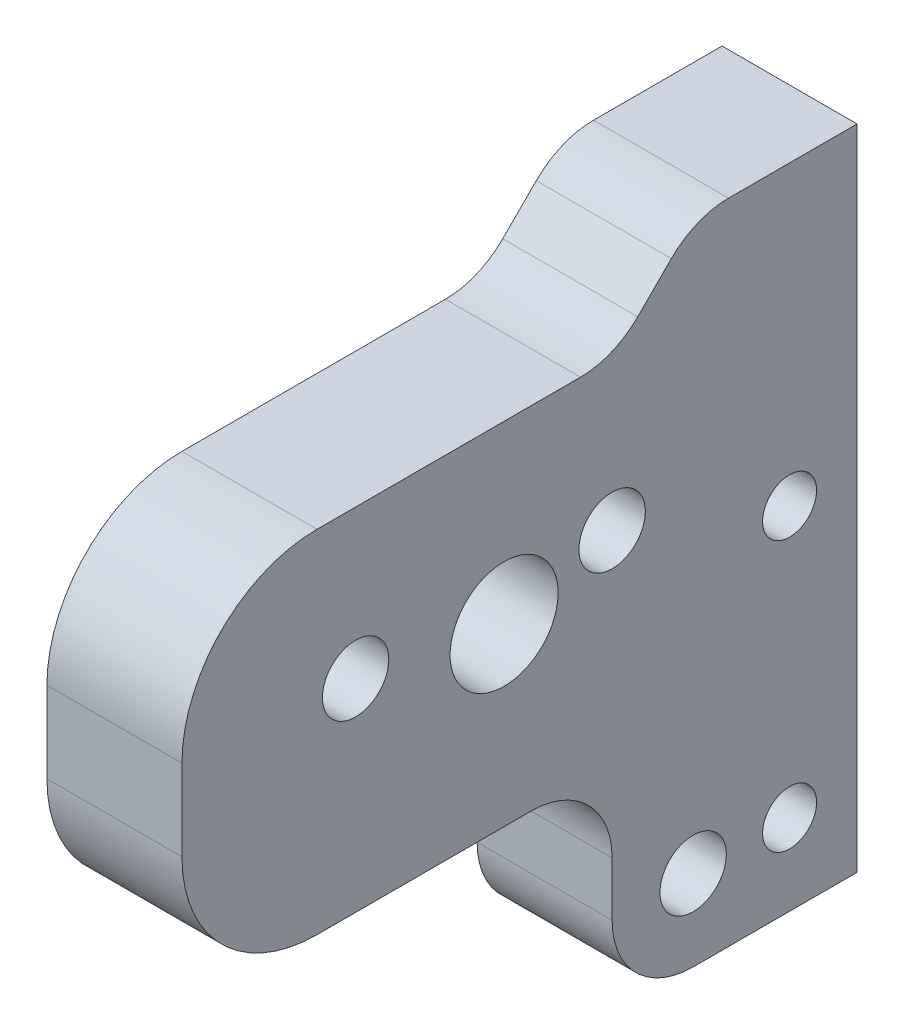
ISO-10303-21;
HEADER;
FILE_DESCRIPTION(('STEP AP214'),'2;1');
FILE_NAME('part.step','',(''),(''),'','','');
FILE_SCHEMA(('AUTOMOTIVE_DESIGN { 1 0 10303 214 1 1 1 1 }'));
ENDSEC;
DATA;
#1=APPLICATION_CONTEXT('core data for automotive mechanical design processes');
#2=APPLICATION_PROTOCOL_DEFINITION('international standard','automotive_design',2000,#1);
#3=PRODUCT_CONTEXT('',#1,'mechanical');
#4=PRODUCT('Part','Part','',(#3));
#5=PRODUCT_RELATED_PRODUCT_CATEGORY('part','',(#4));
#6=PRODUCT_DEFINITION_FORMATION('','',#4);
#7=PRODUCT_DEFINITION_CONTEXT('part definition',#1,'design');
#8=PRODUCT_DEFINITION('design','',#6,#7);
#9=PRODUCT_DEFINITION_SHAPE('','',#8);
#10=(LENGTH_UNIT() NAMED_UNIT(*) SI_UNIT(.MILLI.,.METRE.));
#11=(NAMED_UNIT(*) PLANE_ANGLE_UNIT() SI_UNIT($,.RADIAN.));
#12=(NAMED_UNIT(*) SI_UNIT($,.STERADIAN.) SOLID_ANGLE_UNIT());
#13=UNCERTAINTY_MEASURE_WITH_UNIT(LENGTH_MEASURE(1.E-05),#10,'distance_accuracy_value','');
#14=(GEOMETRIC_REPRESENTATION_CONTEXT(3) GLOBAL_UNCERTAINTY_ASSIGNED_CONTEXT((#13)) GLOBAL_UNIT_ASSIGNED_CONTEXT((#10,
#11,#12)) REPRESENTATION_CONTEXT('',''));
#15=CARTESIAN_POINT('',(0.,0.,0.));
#16=DIRECTION('',(0.,0.,1.));
#17=DIRECTION('',(1.,0.,0.));
#18=AXIS2_PLACEMENT_3D('',#15,#16,#17);
#19=CARTESIAN_POINT('',(5.,-8.729138766001,-7.36228469191367));
#20=DIRECTION('',(1.,0.,0.));
#21=DIRECTION('',(0.,0.,-1.));
#22=AXIS2_PLACEMENT_3D('',#19,#20,#21);
#23=PLANE('',#22);
#24=CARTESIAN_POINT('',(5.,-8.729138766001,-10.9322846915003));
#25=DIRECTION('',(1.,0.,0.));
#26=DIRECTION('',(0.,0.,-1.));
#27=AXIS2_PLACEMENT_3D('',#24,#25,#26);
#28=CIRCLE('',#27,1.);
#29=CARTESIAN_POINT('',(5.,-8.729138766001,-11.9322846915003));
#30=VERTEX_POINT('',#29);
#31=EDGE_CURVE('E287',#30,#30,#28,.T.);
#32=ORIENTED_EDGE('',*,*,#31,.F.);
#33=EDGE_LOOP('',(#32));
#34=FACE_BOUND('',#33,.T.);
#35=CARTESIAN_POINT('',(5.,3.77086123413889,-4.36228469150025));
#36=DIRECTION('',(1.,0.,0.));
#37=DIRECTION('',(0.,0.,-1.));
#38=AXIS2_PLACEMENT_3D('',#35,#36,#37);
#39=CIRCLE('',#38,1.2295);
#40=CARTESIAN_POINT('',(5.,3.77086123413889,-5.59178469150025));
#41=VERTEX_POINT('',#40);
#42=EDGE_CURVE('E279',#41,#41,#39,.T.);
#43=ORIENTED_EDGE('',*,*,#42,.F.);
#44=EDGE_LOOP('',(#43));
#45=FACE_BOUND('',#44,.T.);
#46=CARTESIAN_POINT('',(5.,3.77086123413892,5.13771530849975));
#47=DIRECTION('',(1.,0.,0.));
#48=DIRECTION('',(0.,0.,-1.));
#49=AXIS2_PLACEMENT_3D('',#46,#47,#48);
#50=CIRCLE('',#49,1.2295);
#51=CARTESIAN_POINT('',(5.,3.77086123413892,3.90821530849975));
#52=VERTEX_POINT('',#51);
#53=EDGE_CURVE('E253',#52,#52,#50,.T.);
#54=ORIENTED_EDGE('',*,*,#53,.F.);
#55=EDGE_LOOP('',(#54));
#56=FACE_BOUND('',#55,.T.);
#57=DIRECTION('',(0.,0.,1.));
#58=VECTOR('',#57,1.);
#59=CARTESIAN_POINT('',(5.,9.270861233999,8.56771530849975));
#60=LINE('',#59,#58);
#61=CARTESIAN_POINT('',(5.,9.270861233999,-3.18964400438096));
#62=VERTEX_POINT('',#61);
#63=CARTESIAN_POINT('',(5.,9.270861233999,6.56771530849975));
#64=VERTEX_POINT('',#63);
#65=EDGE_CURVE('E183',#62,#64,#60,.T.);
#66=ORIENTED_EDGE('',*,*,#65,.T.);
#67=CARTESIAN_POINT('',(5.,4.270861233999,6.56771530849975));
#68=DIRECTION('',(1.,0.,0.));
#69=DIRECTION('',(0.,0.,-1.));
#70=AXIS2_PLACEMENT_3D('',#67,#68,#69);
#71=CIRCLE('',#70,5.);
#72=CARTESIAN_POINT('',(5.,4.27086123399899,11.5677153084997));
#73=VERTEX_POINT('',#72);
#74=EDGE_CURVE('E46',#64,#73,#71,.T.);
#75=ORIENTED_EDGE('',*,*,#74,.T.);
#76=DIRECTION('',(0.,-1.,0.));
#77=VECTOR('',#76,1.);
#78=CARTESIAN_POINT('',(5.,-3.729138766001,11.5677153084997));
#79=LINE('',#78,#77);
#80=CARTESIAN_POINT('',(5.,1.27086123399899,11.5677153084997));
#81=VERTEX_POINT('',#80);
#82=EDGE_CURVE('E182',#73,#81,#79,.T.);
#83=ORIENTED_EDGE('',*,*,#82,.T.);
#84=CARTESIAN_POINT('',(5.,1.270861233999,6.56771530849974));
#85=DIRECTION('',(1.,0.,0.));
#86=DIRECTION('',(0.,0.,-1.));
#87=AXIS2_PLACEMENT_3D('',#84,#85,#86);
#88=CIRCLE('',#87,5.);
#89=CARTESIAN_POINT('',(5.,-3.729138766001,6.56771530849974));
#90=VERTEX_POINT('',#89);
#91=EDGE_CURVE('E52',#81,#90,#88,.T.);
#92=ORIENTED_EDGE('',*,*,#91,.T.);
#93=DIRECTION('',(0.,0.,-1.));
#94=VECTOR('',#93,1.);
#95=CARTESIAN_POINT('',(5.,-3.729138766001,-1.36228469191368));
#96=LINE('',#95,#94);
#97=CARTESIAN_POINT('',(5.,-3.729138766001,-1.36228469191368));
#98=VERTEX_POINT('',#97);
#99=EDGE_CURVE('E195',#90,#98,#96,.T.);
#100=ORIENTED_EDGE('',*,*,#99,.T.);
#101=CARTESIAN_POINT('',(5.,-6.729138766001,-1.36228469191368));
#102=DIRECTION('',(-1.,0.,0.));
#103=DIRECTION('',(0.,0.,-1.));
#104=AXIS2_PLACEMENT_3D('',#101,#102,#103);
#105=CIRCLE('',#104,3.);
#106=CARTESIAN_POINT('',(5.,-6.72913876600097,-4.36228469191368));
#107=VERTEX_POINT('',#106);
#108=EDGE_CURVE('E261',#98,#107,#105,.T.);
#109=ORIENTED_EDGE('',*,*,#108,.T.);
#110=DIRECTION('',(0.,-1.,0.));
#111=VECTOR('',#110,1.);
#112=CARTESIAN_POINT('',(5.,-8.729138766001,-4.36228469191368));
#113=LINE('',#112,#111);
#114=CARTESIAN_POINT('',(5.,-8.729138766001,-4.36228469191368));
#115=VERTEX_POINT('',#114);
#116=EDGE_CURVE('E256',#107,#115,#113,.T.);
#117=ORIENTED_EDGE('',*,*,#116,.T.);
#118=CARTESIAN_POINT('',(5.,-8.729138766001,-7.36228469191367));
#119=DIRECTION('',(1.,0.,0.));
#120=DIRECTION('',(0.,0.,-1.));
#121=AXIS2_PLACEMENT_3D('',#118,#119,#120);
#122=CIRCLE('',#121,3.);
#123=CARTESIAN_POINT('',(5.,-11.729138766001,-7.36228469191367));
#124=VERTEX_POINT('',#123);
#125=EDGE_CURVE('E260',#115,#124,#122,.T.);
#126=ORIENTED_EDGE('',*,*,#125,.T.);
#127=DIRECTION('',(0.,0.,-1.));
#128=VECTOR('',#127,1.);
#129=CARTESIAN_POINT('',(5.,-11.729138766001,-13.4322846915003));
#130=LINE('',#129,#128);
#131=CARTESIAN_POINT('',(5.,-11.729138766001,-13.4322846915003));
#132=VERTEX_POINT('',#131);
#133=EDGE_CURVE('E160',#124,#132,#130,.T.);
#134=ORIENTED_EDGE('',*,*,#133,.T.);
#135=DIRECTION('',(0.,1.,0.));
#136=VECTOR('',#135,1.);
#137=CARTESIAN_POINT('',(5.,12.270861233999,-13.4322846915003));
#138=LINE('',#137,#136);
#139=CARTESIAN_POINT('',(5.,12.270861233999,-13.4322846915003));
#140=VERTEX_POINT('',#139);
#141=EDGE_CURVE('E155',#132,#140,#138,.T.);
#142=ORIENTED_EDGE('',*,*,#141,.T.);
#143=DIRECTION('',(0.,0.,1.));
#144=VECTOR('',#143,1.);
#145=CARTESIAN_POINT('',(5.,12.270861233999,-8.67492537861952));
#146=LINE('',#145,#144);
#147=CARTESIAN_POINT('',(5.,12.270861233999,-8.67492537861952));
#148=VERTEX_POINT('',#147);
#149=EDGE_CURVE('E145',#140,#148,#146,.T.);
#150=ORIENTED_EDGE('',*,*,#149,.T.);
#151=CARTESIAN_POINT('',(5.,9.270861233999,-8.67492537861953));
#152=DIRECTION('',(1.,0.,0.));
#153=DIRECTION('',(0.,0.,-1.));
#154=AXIS2_PLACEMENT_3D('',#151,#152,#153);
#155=CIRCLE('',#154,3.00000000000001);
#156=CARTESIAN_POINT('',(5.,11.3921815775586,-6.55360503505988));
#157=VERTEX_POINT('',#156);
#158=EDGE_CURVE('E151',#148,#157,#155,.T.);
#159=ORIENTED_EDGE('',*,*,#158,.T.);
#160=DIRECTION('',(0.,-0.707106781186548,0.707106781186547));
#161=VECTOR('',#160,1.);
#162=CARTESIAN_POINT('',(5.,11.3921815775586,-6.55360503505988));
#163=LINE('',#162,#161);
#164=CARTESIAN_POINT('',(5.,10.1495408904394,-5.3109643479406));
#165=VERTEX_POINT('',#164);
#166=EDGE_CURVE('E246',#157,#165,#163,.T.);
#167=ORIENTED_EDGE('',*,*,#166,.T.);
#168=CARTESIAN_POINT('',(5.,12.270861233999,-3.18964400438097));
#169=DIRECTION('',(-1.,0.,0.));
#170=DIRECTION('',(0.,0.,-1.));
#171=AXIS2_PLACEMENT_3D('',#168,#169,#170);
#172=CIRCLE('',#171,2.99999999999999);
#173=EDGE_CURVE('E264',#165,#62,#172,.T.);
#174=ORIENTED_EDGE('',*,*,#173,.T.);
#175=EDGE_LOOP('',(#66,#75,#83,#92,#100,#109,#117,#126,#134,#142,#150,#159,#167,#174));
#176=FACE_BOUND('',#175,.T.);
#177=CARTESIAN_POINT('',(5.,2.770861233999,-0.36228469150025));
#178=DIRECTION('',(1.,0.,0.));
#179=DIRECTION('',(0.,0.,-1.));
#180=AXIS2_PLACEMENT_3D('',#177,#178,#179);
#181=CIRCLE('',#180,2.);
#182=CARTESIAN_POINT('',(5.,2.770861233999,-2.36228469150025));
#183=VERTEX_POINT('',#182);
#184=EDGE_CURVE('E275',#183,#183,#181,.T.);
#185=ORIENTED_EDGE('',*,*,#184,.F.);
#186=EDGE_LOOP('',(#185));
#187=FACE_BOUND('',#186,.T.);
#188=CARTESIAN_POINT('',(5.,-8.729138766001,-7.36228469191367));
#189=DIRECTION('',(1.,0.,0.));
#190=DIRECTION('',(0.,0.,-1.));
#191=AXIS2_PLACEMENT_3D('',#188,#189,#190);
#192=CIRCLE('',#191,1.2295);
#193=CARTESIAN_POINT('',(5.,-8.729138766001,-8.59178469191367));
#194=VERTEX_POINT('',#193);
#195=EDGE_CURVE('E283',#194,#194,#192,.T.);
#196=ORIENTED_EDGE('',*,*,#195,.F.);
#197=EDGE_LOOP('',(#196));
#198=FACE_BOUND('',#197,.T.);
#199=CARTESIAN_POINT('',(5.,1.270861233999,-10.9322846915003));
#200=DIRECTION('',(1.,0.,0.));
#201=DIRECTION('',(0.,0.,-1.));
#202=AXIS2_PLACEMENT_3D('',#199,#200,#201);
#203=CIRCLE('',#202,0.999999999999998);
#204=CARTESIAN_POINT('',(5.,1.270861233999,-11.9322846915002));
#205=VERTEX_POINT('',#204);
#206=EDGE_CURVE('E298',#205,#205,#203,.T.);
#207=ORIENTED_EDGE('',*,*,#206,.F.);
#208=EDGE_LOOP('',(#207));
#209=FACE_BOUND('',#208,.T.);
#210=ADVANCED_FACE('F36',(#34,#45,#56,#176,#187,#198,#209),#23,.T.);
#211=CARTESIAN_POINT('',(0.,-8.729138766001,-7.36228469191367));
#212=DIRECTION('',(1.,0.,0.));
#213=DIRECTION('',(0.,0.,-1.));
#214=AXIS2_PLACEMENT_3D('',#211,#212,#213);
#215=PLANE('',#214);
#216=DIRECTION('',(0.,-1.,0.));
#217=VECTOR('',#216,1.);
#218=CARTESIAN_POINT('',(0.,-3.729138766001,11.5677153084997));
#219=LINE('',#218,#217);
#220=CARTESIAN_POINT('',(0.,4.27086123399899,11.5677153084997));
#221=VERTEX_POINT('',#220);
#222=CARTESIAN_POINT('',(0.,1.27086123399899,11.5677153084997));
#223=VERTEX_POINT('',#222);
#224=EDGE_CURVE('E202',#221,#223,#219,.T.);
#225=ORIENTED_EDGE('',*,*,#224,.F.);
#226=CARTESIAN_POINT('',(0.,4.270861233999,6.56771530849975));
#227=DIRECTION('',(1.,0.,0.));
#228=DIRECTION('',(0.,0.,-1.));
#229=AXIS2_PLACEMENT_3D('',#226,#227,#228);
#230=CIRCLE('',#229,5.);
#231=CARTESIAN_POINT('',(0.,9.270861233999,6.56771530849975));
#232=VERTEX_POINT('',#231);
#233=EDGE_CURVE('E178',#221,#232,#230,.F.);
#234=ORIENTED_EDGE('',*,*,#233,.T.);
#235=DIRECTION('',(0.,0.,1.));
#236=VECTOR('',#235,1.);
#237=CARTESIAN_POINT('',(0.,9.270861233999,11.5677153084998));
#238=LINE('',#237,#236);
#239=CARTESIAN_POINT('',(0.,9.270861233999,-3.18964400438096));
#240=VERTEX_POINT('',#239);
#241=EDGE_CURVE('E198',#240,#232,#238,.T.);
#242=ORIENTED_EDGE('',*,*,#241,.F.);
#243=CARTESIAN_POINT('',(0.,12.270861233999,-3.18964400438097));
#244=DIRECTION('',(-1.,0.,0.));
#245=DIRECTION('',(0.,0.,-1.));
#246=AXIS2_PLACEMENT_3D('',#243,#244,#245);
#247=CIRCLE('',#246,2.99999999999999);
#248=CARTESIAN_POINT('',(0.,10.1495408904394,-5.3109643479406));
#249=VERTEX_POINT('',#248);
#250=EDGE_CURVE('E207',#249,#240,#247,.T.);
#251=ORIENTED_EDGE('',*,*,#250,.F.);
#252=DIRECTION('',(0.,-0.707106781186548,0.707106781186547));
#253=VECTOR('',#252,1.);
#254=CARTESIAN_POINT('',(0.,11.3921815775586,-6.55360503505988));
#255=LINE('',#254,#253);
#256=CARTESIAN_POINT('',(0.,11.3921815775586,-6.55360503505988));
#257=VERTEX_POINT('',#256);
#258=EDGE_CURVE('E208',#257,#249,#255,.T.);
#259=ORIENTED_EDGE('',*,*,#258,.F.);
#260=CARTESIAN_POINT('',(0.,9.270861233999,-8.67492537861953));
#261=DIRECTION('',(1.,0.,0.));
#262=DIRECTION('',(0.,0.,-1.));
#263=AXIS2_PLACEMENT_3D('',#260,#261,#262);
#264=CIRCLE('',#263,3.00000000000001);
#265=CARTESIAN_POINT('',(0.,12.270861233999,-8.67492537861952));
#266=VERTEX_POINT('',#265);
#267=EDGE_CURVE('E248',#266,#257,#264,.T.);
#268=ORIENTED_EDGE('',*,*,#267,.F.);
#269=DIRECTION('',(0.,0.,1.));
#270=VECTOR('',#269,1.);
#271=CARTESIAN_POINT('',(0.,12.270861233999,-8.67492537861952));
#272=LINE('',#271,#270);
#273=CARTESIAN_POINT('',(0.,12.270861233999,-13.4322846915003));
#274=VERTEX_POINT('',#273);
#275=EDGE_CURVE('E249',#274,#266,#272,.T.);
#276=ORIENTED_EDGE('',*,*,#275,.F.);
#277=DIRECTION('',(0.,1.,0.));
#278=VECTOR('',#277,1.);
#279=CARTESIAN_POINT('',(0.,12.270861233999,-13.4322846915003));
#280=LINE('',#279,#278);
#281=CARTESIAN_POINT('',(0.,-11.729138766001,-13.4322846915003));
#282=VERTEX_POINT('',#281);
#283=EDGE_CURVE('E164',#282,#274,#280,.T.);
#284=ORIENTED_EDGE('',*,*,#283,.F.);
#285=DIRECTION('',(0.,0.,-1.));
#286=VECTOR('',#285,1.);
#287=CARTESIAN_POINT('',(0.,-11.729138766001,-13.4322846915003));
#288=LINE('',#287,#286);
#289=CARTESIAN_POINT('',(0.,-11.729138766001,-7.36228469191367));
#290=VERTEX_POINT('',#289);
#291=EDGE_CURVE('E163',#290,#282,#288,.T.);
#292=ORIENTED_EDGE('',*,*,#291,.F.);
#293=CARTESIAN_POINT('',(0.,-8.729138766001,-7.36228469191367));
#294=DIRECTION('',(1.,0.,0.));
#295=DIRECTION('',(0.,0.,-1.));
#296=AXIS2_PLACEMENT_3D('',#293,#294,#295);
#297=CIRCLE('',#296,3.);
#298=CARTESIAN_POINT('',(0.,-8.729138766001,-4.36228469191368));
#299=VERTEX_POINT('',#298);
#300=EDGE_CURVE('E218',#299,#290,#297,.T.);
#301=ORIENTED_EDGE('',*,*,#300,.F.);
#302=DIRECTION('',(0.,-1.,0.));
#303=VECTOR('',#302,1.);
#304=CARTESIAN_POINT('',(0.,-8.729138766001,-4.36228469191368));
#305=LINE('',#304,#303);
#306=CARTESIAN_POINT('',(0.,-6.72913876600097,-4.36228469191368));
#307=VERTEX_POINT('',#306);
#308=EDGE_CURVE('E220',#307,#299,#305,.T.);
#309=ORIENTED_EDGE('',*,*,#308,.F.);
#310=CARTESIAN_POINT('',(0.,-6.729138766001,-1.36228469191368));
#311=DIRECTION('',(-1.,0.,0.));
#312=DIRECTION('',(0.,0.,-1.));
#313=AXIS2_PLACEMENT_3D('',#310,#311,#312);
#314=CIRCLE('',#313,3.);
#315=CARTESIAN_POINT('',(0.,-3.729138766001,-1.36228469191368));
#316=VERTEX_POINT('',#315);
#317=EDGE_CURVE('E213',#316,#307,#314,.T.);
#318=ORIENTED_EDGE('',*,*,#317,.F.);
#319=DIRECTION('',(0.,0.,-1.));
#320=VECTOR('',#319,1.);
#321=CARTESIAN_POINT('',(0.,-3.729138766001,-1.36228469191368));
#322=LINE('',#321,#320);
#323=CARTESIAN_POINT('',(0.,-3.729138766001,6.56771530849974));
#324=VERTEX_POINT('',#323);
#325=EDGE_CURVE('E206',#324,#316,#322,.T.);
#326=ORIENTED_EDGE('',*,*,#325,.F.);
#327=CARTESIAN_POINT('',(0.,1.270861233999,6.56771530849974));
#328=DIRECTION('',(1.,0.,0.));
#329=DIRECTION('',(0.,0.,-1.));
#330=AXIS2_PLACEMENT_3D('',#327,#328,#329);
#331=CIRCLE('',#330,5.);
#332=EDGE_CURVE('E176',#324,#223,#331,.F.);
#333=ORIENTED_EDGE('',*,*,#332,.T.);
#334=EDGE_LOOP('',(#225,#234,#242,#251,#259,#268,#276,#284,#292,#301,#309,#318,#326,#333));
#335=FACE_BOUND('',#334,.T.);
#336=CARTESIAN_POINT('',(0.,3.77086123413892,5.13771530849975));
#337=DIRECTION('',(1.,0.,0.));
#338=DIRECTION('',(0.,0.,-1.));
#339=AXIS2_PLACEMENT_3D('',#336,#337,#338);
#340=CIRCLE('',#339,1.2295);
#341=CARTESIAN_POINT('',(0.,3.77086123413892,3.90821530849975));
#342=VERTEX_POINT('',#341);
#343=EDGE_CURVE('E266',#342,#342,#340,.T.);
#344=ORIENTED_EDGE('',*,*,#343,.T.);
#345=EDGE_LOOP('',(#344));
#346=FACE_BOUND('',#345,.T.);
#347=CARTESIAN_POINT('',(0.,2.770861233999,-0.36228469150025));
#348=DIRECTION('',(1.,0.,0.));
#349=DIRECTION('',(0.,0.,-1.));
#350=AXIS2_PLACEMENT_3D('',#347,#348,#349);
#351=CIRCLE('',#350,2.);
#352=CARTESIAN_POINT('',(0.,2.770861233999,-2.36228469150025));
#353=VERTEX_POINT('',#352);
#354=EDGE_CURVE('E273',#353,#353,#351,.T.);
#355=ORIENTED_EDGE('',*,*,#354,.T.);
#356=EDGE_LOOP('',(#355));
#357=FACE_BOUND('',#356,.T.);
#358=CARTESIAN_POINT('',(0.,3.77086123413889,-4.36228469150025));
#359=DIRECTION('',(1.,0.,0.));
#360=DIRECTION('',(0.,0.,-1.));
#361=AXIS2_PLACEMENT_3D('',#358,#359,#360);
#362=CIRCLE('',#361,1.2295);
#363=CARTESIAN_POINT('',(0.,3.77086123413889,-5.59178469150025));
#364=VERTEX_POINT('',#363);
#365=EDGE_CURVE('E281',#364,#364,#362,.T.);
#366=ORIENTED_EDGE('',*,*,#365,.T.);
#367=EDGE_LOOP('',(#366));
#368=FACE_BOUND('',#367,.T.);
#369=CARTESIAN_POINT('',(0.,-8.729138766001,-7.36228469191367));
#370=DIRECTION('',(1.,0.,0.));
#371=DIRECTION('',(0.,0.,-1.));
#372=AXIS2_PLACEMENT_3D('',#369,#370,#371);
#373=CIRCLE('',#372,1.2295);
#374=CARTESIAN_POINT('',(0.,-8.729138766001,-8.59178469191367));
#375=VERTEX_POINT('',#374);
#376=EDGE_CURVE('E290',#375,#375,#373,.T.);
#377=ORIENTED_EDGE('',*,*,#376,.T.);
#378=EDGE_LOOP('',(#377));
#379=FACE_BOUND('',#378,.T.);
#380=CARTESIAN_POINT('',(0.,-8.729138766001,-10.9322846915003));
#381=DIRECTION('',(1.,0.,0.));
#382=DIRECTION('',(0.,0.,-1.));
#383=AXIS2_PLACEMENT_3D('',#380,#381,#382);
#384=CIRCLE('',#383,1.);
#385=CARTESIAN_POINT('',(0.,-8.729138766001,-11.9322846915003));
#386=VERTEX_POINT('',#385);
#387=EDGE_CURVE('E291',#386,#386,#384,.T.);
#388=ORIENTED_EDGE('',*,*,#387,.T.);
#389=EDGE_LOOP('',(#388));
#390=FACE_BOUND('',#389,.T.);
#391=CARTESIAN_POINT('',(0.,1.270861233999,-10.9322846915003));
#392=DIRECTION('',(1.,0.,0.));
#393=DIRECTION('',(0.,0.,-1.));
#394=AXIS2_PLACEMENT_3D('',#391,#392,#393);
#395=CIRCLE('',#394,0.999999999999998);
#396=CARTESIAN_POINT('',(0.,1.270861233999,-11.9322846915002));
#397=VERTEX_POINT('',#396);
#398=EDGE_CURVE('E299',#397,#397,#395,.T.);
#399=ORIENTED_EDGE('',*,*,#398,.T.);
#400=EDGE_LOOP('',(#399));
#401=FACE_BOUND('',#400,.T.);
#402=ADVANCED_FACE('F196',(#335,#346,#357,#368,#379,#390,#401),#215,.F.);
#403=CARTESIAN_POINT('',(5.,12.270861233999,-13.4322846915003));
#404=DIRECTION('',(0.,0.,1.));
#405=DIRECTION('',(1.,0.,0.));
#406=AXIS2_PLACEMENT_3D('',#403,#404,#405);
#407=PLANE('',#406);
#408=CARTESIAN_POINT('',(2.5,8.770861233999,-13.4322846915003));
#409=DIRECTION('',(0.,0.,-1.));
#410=DIRECTION('',(-1.,0.,0.));
#411=AXIS2_PLACEMENT_3D('',#408,#409,#410);
#412=CIRCLE('',#411,1.25);
#413=CARTESIAN_POINT('',(1.25,8.770861233999,-13.4322846915003));
#414=VERTEX_POINT('',#413);
#415=EDGE_CURVE('E311',#414,#414,#412,.T.);
#416=ORIENTED_EDGE('',*,*,#415,.F.);
#417=EDGE_LOOP('',(#416));
#418=FACE_BOUND('',#417,.T.);
#419=CARTESIAN_POINT('',(2.5,-5.229138766001,-13.4322846915003));
#420=DIRECTION('',(0.,0.,-1.));
#421=DIRECTION('',(-1.,0.,0.));
#422=AXIS2_PLACEMENT_3D('',#419,#420,#421);
#423=CIRCLE('',#422,1.25);
#424=CARTESIAN_POINT('',(1.25,-5.229138766001,-13.4322846915003));
#425=VERTEX_POINT('',#424);
#426=EDGE_CURVE('E308',#425,#425,#423,.T.);
#427=ORIENTED_EDGE('',*,*,#426,.F.);
#428=EDGE_LOOP('',(#427));
#429=FACE_BOUND('',#428,.T.);
#430=ORIENTED_EDGE('',*,*,#283,.T.);
#431=DIRECTION('',(-1.,0.,0.));
#432=VECTOR('',#431,1.);
#433=CARTESIAN_POINT('',(5.,12.270861233999,-13.4322846915003));
#434=LINE('',#433,#432);
#435=EDGE_CURVE('E147',#140,#274,#434,.T.);
#436=ORIENTED_EDGE('',*,*,#435,.F.);
#437=ORIENTED_EDGE('',*,*,#141,.F.);
#438=DIRECTION('',(-1.,0.,0.));
#439=VECTOR('',#438,1.);
#440=CARTESIAN_POINT('',(5.,-11.729138766001,-13.4322846915003));
#441=LINE('',#440,#439);
#442=EDGE_CURVE('E225',#132,#282,#441,.T.);
#443=ORIENTED_EDGE('',*,*,#442,.T.);
#444=EDGE_LOOP('',(#430,#436,#437,#443));
#445=FACE_BOUND('',#444,.T.);
#446=ADVANCED_FACE('F161',(#418,#429,#445),#407,.F.);
#447=CARTESIAN_POINT('',(5.,12.270861233999,-8.67492537861952));
#448=DIRECTION('',(0.,-1.,0.));
#449=DIRECTION('',(0.,0.,-1.));
#450=AXIS2_PLACEMENT_3D('',#447,#448,#449);
#451=PLANE('',#450);
#452=ORIENTED_EDGE('',*,*,#275,.T.);
#453=DIRECTION('',(-1.,0.,0.));
#454=VECTOR('',#453,1.);
#455=CARTESIAN_POINT('',(5.,12.270861233999,-8.67492537861952));
#456=LINE('',#455,#454);
#457=EDGE_CURVE('E146',#148,#266,#456,.T.);
#458=ORIENTED_EDGE('',*,*,#457,.F.);
#459=ORIENTED_EDGE('',*,*,#149,.F.);
#460=ORIENTED_EDGE('',*,*,#435,.T.);
#461=EDGE_LOOP('',(#452,#458,#459,#460));
#462=FACE_BOUND('',#461,.T.);
#463=ADVANCED_FACE('F144',(#462),#451,.F.);
#464=CARTESIAN_POINT('',(5.,9.270861233999,-8.67492537861953));
#465=DIRECTION('',(-1.,0.,0.));
#466=DIRECTION('',(0.,0.,1.));
#467=AXIS2_PLACEMENT_3D('',#464,#465,#466);
#468=CYLINDRICAL_SURFACE('',#467,3.00000000000001);
#469=ORIENTED_EDGE('',*,*,#267,.T.);
#470=DIRECTION('',(-1.,0.,0.));
#471=VECTOR('',#470,1.);
#472=CARTESIAN_POINT('',(5.,11.3921815775586,-6.55360503505988));
#473=LINE('',#472,#471);
#474=EDGE_CURVE('E167',#157,#257,#473,.T.);
#475=ORIENTED_EDGE('',*,*,#474,.F.);
#476=ORIENTED_EDGE('',*,*,#158,.F.);
#477=ORIENTED_EDGE('',*,*,#457,.T.);
#478=EDGE_LOOP('',(#469,#475,#476,#477));
#479=FACE_BOUND('',#478,.T.);
#480=ADVANCED_FACE('F388',(#479),#468,.T.);
#481=CARTESIAN_POINT('',(5.,11.3921815775586,-6.55360503505988));
#482=DIRECTION('',(0.,-0.707106781186547,-0.707106781186548));
#483=DIRECTION('',(0.,0.707106781186548,-0.707106781186547));
#484=AXIS2_PLACEMENT_3D('',#481,#482,#483);
#485=PLANE('',#484);
#486=ORIENTED_EDGE('',*,*,#258,.T.);
#487=DIRECTION('',(-1.,0.,0.));
#488=VECTOR('',#487,1.);
#489=CARTESIAN_POINT('',(5.,10.1495408904394,-5.3109643479406));
#490=LINE('',#489,#488);
#491=EDGE_CURVE('E240',#165,#249,#490,.T.);
#492=ORIENTED_EDGE('',*,*,#491,.F.);
#493=ORIENTED_EDGE('',*,*,#166,.F.);
#494=ORIENTED_EDGE('',*,*,#474,.T.);
#495=EDGE_LOOP('',(#486,#492,#493,#494));
#496=FACE_BOUND('',#495,.T.);
#497=ADVANCED_FACE('F242',(#496),#485,.F.);
#498=CARTESIAN_POINT('',(5.,12.270861233999,-3.18964400438097));
#499=DIRECTION('',(-1.,0.,0.));
#500=DIRECTION('',(0.,0.,1.));
#501=AXIS2_PLACEMENT_3D('',#498,#499,#500);
#502=CYLINDRICAL_SURFACE('',#501,2.99999999999999);
#503=ORIENTED_EDGE('',*,*,#250,.T.);
#504=DIRECTION('',(-1.,0.,0.));
#505=VECTOR('',#504,1.);
#506=CARTESIAN_POINT('',(5.,9.270861233999,-3.18964400438096));
#507=LINE('',#506,#505);
#508=EDGE_CURVE('E203',#62,#240,#507,.T.);
#509=ORIENTED_EDGE('',*,*,#508,.F.);
#510=ORIENTED_EDGE('',*,*,#173,.F.);
#511=ORIENTED_EDGE('',*,*,#491,.T.);
#512=EDGE_LOOP('',(#503,#509,#510,#511));
#513=FACE_BOUND('',#512,.T.);
#514=ADVANCED_FACE('F381',(#513),#502,.F.);
#515=CARTESIAN_POINT('',(5.,9.270861233999,11.5677153084998));
#516=DIRECTION('',(0.,-1.,0.));
#517=DIRECTION('',(0.,0.,-1.));
#518=AXIS2_PLACEMENT_3D('',#515,#516,#517);
#519=PLANE('',#518);
#520=ORIENTED_EDGE('',*,*,#241,.T.);
#521=DIRECTION('',(-1.,0.,0.));
#522=VECTOR('',#521,1.);
#523=CARTESIAN_POINT('',(5.,9.270861233999,6.56771530849975));
#524=LINE('',#523,#522);
#525=EDGE_CURVE('E62',#232,#64,#524,.F.);
#526=ORIENTED_EDGE('',*,*,#525,.T.);
#527=ORIENTED_EDGE('',*,*,#65,.F.);
#528=ORIENTED_EDGE('',*,*,#508,.T.);
#529=EDGE_LOOP('',(#520,#526,#527,#528));
#530=FACE_BOUND('',#529,.T.);
#531=ADVANCED_FACE('F205',(#530),#519,.F.);
#532=CARTESIAN_POINT('',(5.,-3.729138766001,11.5677153084997));
#533=DIRECTION('',(0.,0.,-1.));
#534=DIRECTION('',(0.,1.,0.));
#535=AXIS2_PLACEMENT_3D('',#532,#533,#534);
#536=PLANE('',#535);
#537=ORIENTED_EDGE('',*,*,#82,.F.);
#538=DIRECTION('',(-1.,0.,0.));
#539=VECTOR('',#538,1.);
#540=CARTESIAN_POINT('',(5.,4.27086123399899,11.5677153084997));
#541=LINE('',#540,#539);
#542=EDGE_CURVE('E166',#73,#221,#541,.T.);
#543=ORIENTED_EDGE('',*,*,#542,.T.);
#544=ORIENTED_EDGE('',*,*,#224,.T.);
#545=DIRECTION('',(-1.,0.,0.));
#546=VECTOR('',#545,1.);
#547=CARTESIAN_POINT('',(5.,1.27086123399899,11.5677153084997));
#548=LINE('',#547,#546);
#549=EDGE_CURVE('E168',#223,#81,#548,.F.);
#550=ORIENTED_EDGE('',*,*,#549,.T.);
#551=EDGE_LOOP('',(#537,#543,#544,#550));
#552=FACE_BOUND('',#551,.T.);
#553=ADVANCED_FACE('F189',(#552),#536,.F.);
#554=CARTESIAN_POINT('',(5.,-3.729138766001,-1.36228469191368));
#555=DIRECTION('',(0.,1.,0.));
#556=DIRECTION('',(0.,0.,1.));
#557=AXIS2_PLACEMENT_3D('',#554,#555,#556);
#558=PLANE('',#557);
#559=ORIENTED_EDGE('',*,*,#99,.F.);
#560=DIRECTION('',(-1.,0.,0.));
#561=VECTOR('',#560,1.);
#562=CARTESIAN_POINT('',(5.,-3.729138766001,6.56771530849974));
#563=LINE('',#562,#561);
#564=EDGE_CURVE('E11',#90,#324,#563,.T.);
#565=ORIENTED_EDGE('',*,*,#564,.T.);
#566=ORIENTED_EDGE('',*,*,#325,.T.);
#567=DIRECTION('',(-1.,0.,0.));
#568=VECTOR('',#567,1.);
#569=CARTESIAN_POINT('',(5.,-3.729138766001,-1.36228469191368));
#570=LINE('',#569,#568);
#571=EDGE_CURVE('E231',#98,#316,#570,.T.);
#572=ORIENTED_EDGE('',*,*,#571,.F.);
#573=EDGE_LOOP('',(#559,#565,#566,#572));
#574=FACE_BOUND('',#573,.T.);
#575=ADVANCED_FACE('F374',(#574),#558,.F.);
#576=CARTESIAN_POINT('',(5.,-6.729138766001,-1.36228469191368));
#577=DIRECTION('',(-1.,0.,0.));
#578=DIRECTION('',(0.,0.,1.));
#579=AXIS2_PLACEMENT_3D('',#576,#577,#578);
#580=CYLINDRICAL_SURFACE('',#579,3.);
#581=ORIENTED_EDGE('',*,*,#317,.T.);
#582=DIRECTION('',(-1.,0.,0.));
#583=VECTOR('',#582,1.);
#584=CARTESIAN_POINT('',(5.,-6.72913876600097,-4.36228469191368));
#585=LINE('',#584,#583);
#586=EDGE_CURVE('E229',#107,#307,#585,.T.);
#587=ORIENTED_EDGE('',*,*,#586,.F.);
#588=ORIENTED_EDGE('',*,*,#108,.F.);
#589=ORIENTED_EDGE('',*,*,#571,.T.);
#590=EDGE_LOOP('',(#581,#587,#588,#589));
#591=FACE_BOUND('',#590,.T.);
#592=ADVANCED_FACE('F371',(#591),#580,.F.);
#593=CARTESIAN_POINT('',(5.,-8.729138766001,-4.36228469191368));
#594=DIRECTION('',(0.,0.,-1.));
#595=DIRECTION('',(0.,1.,0.));
#596=AXIS2_PLACEMENT_3D('',#593,#594,#595);
#597=PLANE('',#596);
#598=ORIENTED_EDGE('',*,*,#308,.T.);
#599=DIRECTION('',(-1.,0.,0.));
#600=VECTOR('',#599,1.);
#601=CARTESIAN_POINT('',(5.,-8.729138766001,-4.36228469191368));
#602=LINE('',#601,#600);
#603=EDGE_CURVE('E227',#115,#299,#602,.T.);
#604=ORIENTED_EDGE('',*,*,#603,.F.);
#605=ORIENTED_EDGE('',*,*,#116,.F.);
#606=ORIENTED_EDGE('',*,*,#586,.T.);
#607=EDGE_LOOP('',(#598,#604,#605,#606));
#608=FACE_BOUND('',#607,.T.);
#609=ADVANCED_FACE('F370',(#608),#597,.F.);
#610=CARTESIAN_POINT('',(5.,-8.729138766001,-7.36228469191367));
#611=DIRECTION('',(-1.,0.,0.));
#612=DIRECTION('',(0.,0.,1.));
#613=AXIS2_PLACEMENT_3D('',#610,#611,#612);
#614=CYLINDRICAL_SURFACE('',#613,3.);
#615=ORIENTED_EDGE('',*,*,#300,.T.);
#616=DIRECTION('',(-1.,0.,0.));
#617=VECTOR('',#616,1.);
#618=CARTESIAN_POINT('',(5.,-11.729138766001,-7.36228469191367));
#619=LINE('',#618,#617);
#620=EDGE_CURVE('E224',#124,#290,#619,.T.);
#621=ORIENTED_EDGE('',*,*,#620,.F.);
#622=ORIENTED_EDGE('',*,*,#125,.F.);
#623=ORIENTED_EDGE('',*,*,#603,.T.);
#624=EDGE_LOOP('',(#615,#621,#622,#623));
#625=FACE_BOUND('',#624,.T.);
#626=ADVANCED_FACE('F361',(#625),#614,.T.);
#627=CARTESIAN_POINT('',(5.,-11.729138766001,-13.4322846915003));
#628=DIRECTION('',(0.,1.,0.));
#629=DIRECTION('',(0.,0.,1.));
#630=AXIS2_PLACEMENT_3D('',#627,#628,#629);
#631=PLANE('',#630);
#632=ORIENTED_EDGE('',*,*,#291,.T.);
#633=ORIENTED_EDGE('',*,*,#442,.F.);
#634=ORIENTED_EDGE('',*,*,#133,.F.);
#635=ORIENTED_EDGE('',*,*,#620,.T.);
#636=EDGE_LOOP('',(#632,#633,#634,#635));
#637=FACE_BOUND('',#636,.T.);
#638=ADVANCED_FACE('F359',(#637),#631,.F.);
#639=CARTESIAN_POINT('',(5.,3.77086123413892,5.13771530849975));
#640=DIRECTION('',(-1.,0.,0.));
#641=DIRECTION('',(0.,0.,1.));
#642=AXIS2_PLACEMENT_3D('',#639,#640,#641);
#643=CYLINDRICAL_SURFACE('',#642,1.2295);
#644=ORIENTED_EDGE('',*,*,#53,.T.);
#645=EDGE_LOOP('',(#644));
#646=FACE_BOUND('',#645,.T.);
#647=ORIENTED_EDGE('',*,*,#343,.F.);
#648=EDGE_LOOP('',(#647));
#649=FACE_BOUND('',#648,.T.);
#650=ADVANCED_FACE('F357',(#646,#649),#643,.F.);
#651=CARTESIAN_POINT('',(5.,2.770861233999,-0.36228469150025));
#652=DIRECTION('',(-1.,0.,0.));
#653=DIRECTION('',(0.,0.,1.));
#654=AXIS2_PLACEMENT_3D('',#651,#652,#653);
#655=CYLINDRICAL_SURFACE('',#654,2.);
#656=ORIENTED_EDGE('',*,*,#184,.T.);
#657=EDGE_LOOP('',(#656));
#658=FACE_BOUND('',#657,.T.);
#659=ORIENTED_EDGE('',*,*,#354,.F.);
#660=EDGE_LOOP('',(#659));
#661=FACE_BOUND('',#660,.T.);
#662=ADVANCED_FACE('F455',(#658,#661),#655,.F.);
#663=CARTESIAN_POINT('',(5.,3.77086123413889,-4.36228469150025));
#664=DIRECTION('',(-1.,0.,0.));
#665=DIRECTION('',(0.,0.,1.));
#666=AXIS2_PLACEMENT_3D('',#663,#664,#665);
#667=CYLINDRICAL_SURFACE('',#666,1.2295);
#668=ORIENTED_EDGE('',*,*,#42,.T.);
#669=EDGE_LOOP('',(#668));
#670=FACE_BOUND('',#669,.T.);
#671=ORIENTED_EDGE('',*,*,#365,.F.);
#672=EDGE_LOOP('',(#671));
#673=FACE_BOUND('',#672,.T.);
#674=ADVANCED_FACE('F445',(#670,#673),#667,.F.);
#675=CARTESIAN_POINT('',(5.,-8.729138766001,-7.36228469191367));
#676=DIRECTION('',(-1.,0.,0.));
#677=DIRECTION('',(0.,0.,1.));
#678=AXIS2_PLACEMENT_3D('',#675,#676,#677);
#679=CYLINDRICAL_SURFACE('',#678,1.2295);
#680=ORIENTED_EDGE('',*,*,#195,.T.);
#681=EDGE_LOOP('',(#680));
#682=FACE_BOUND('',#681,.T.);
#683=ORIENTED_EDGE('',*,*,#376,.F.);
#684=EDGE_LOOP('',(#683));
#685=FACE_BOUND('',#684,.T.);
#686=ADVANCED_FACE('F435',(#682,#685),#679,.F.);
#687=CARTESIAN_POINT('',(5.,-8.729138766001,-10.9322846915003));
#688=DIRECTION('',(-1.,0.,0.));
#689=DIRECTION('',(0.,0.,1.));
#690=AXIS2_PLACEMENT_3D('',#687,#688,#689);
#691=CYLINDRICAL_SURFACE('',#690,1.);
#692=ORIENTED_EDGE('',*,*,#31,.T.);
#693=EDGE_LOOP('',(#692));
#694=FACE_BOUND('',#693,.T.);
#695=ORIENTED_EDGE('',*,*,#387,.F.);
#696=EDGE_LOOP('',(#695));
#697=FACE_BOUND('',#696,.T.);
#698=ADVANCED_FACE('F345',(#694,#697),#691,.F.);
#699=CARTESIAN_POINT('',(5.,1.270861233999,-10.9322846915003));
#700=DIRECTION('',(-1.,0.,0.));
#701=DIRECTION('',(0.,0.,1.));
#702=AXIS2_PLACEMENT_3D('',#699,#700,#701);
#703=CYLINDRICAL_SURFACE('',#702,0.999999999999998);
#704=ORIENTED_EDGE('',*,*,#206,.T.);
#705=EDGE_LOOP('',(#704));
#706=FACE_BOUND('',#705,.T.);
#707=ORIENTED_EDGE('',*,*,#398,.F.);
#708=EDGE_LOOP('',(#707));
#709=FACE_BOUND('',#708,.T.);
#710=ADVANCED_FACE('F335',(#706,#709),#703,.F.);
#711=CARTESIAN_POINT('',(2.5,-5.229138766001,-8.43228469150025));
#712=DIRECTION('',(0.,0.,-1.));
#713=DIRECTION('',(-1.,0.,0.));
#714=AXIS2_PLACEMENT_3D('',#711,#712,#713);
#715=CYLINDRICAL_SURFACE('',#714,1.25);
#716=CARTESIAN_POINT('',(2.5,-5.229138766001,-8.43228469150025));
#717=DIRECTION('',(0.,0.,-1.));
#718=DIRECTION('',(-1.,0.,0.));
#719=AXIS2_PLACEMENT_3D('',#716,#717,#718);
#720=CIRCLE('',#719,1.25);
#721=CARTESIAN_POINT('',(1.25,-5.229138766001,-8.43228469150025));
#722=VERTEX_POINT('',#721);
#723=EDGE_CURVE('E304',#722,#722,#720,.T.);
#724=ORIENTED_EDGE('',*,*,#723,.F.);
#725=EDGE_LOOP('',(#724));
#726=FACE_BOUND('',#725,.T.);
#727=ORIENTED_EDGE('',*,*,#426,.T.);
#728=EDGE_LOOP('',(#727));
#729=FACE_BOUND('',#728,.T.);
#730=ADVANCED_FACE('F332',(#726,#729),#715,.F.);
#731=CARTESIAN_POINT('',(2.5,-5.229138766001,-8.43228469150025));
#732=DIRECTION('',(0.,0.,-1.));
#733=DIRECTION('',(-1.,0.,0.));
#734=AXIS2_PLACEMENT_3D('',#731,#732,#733);
#735=PLANE('',#734);
#736=ORIENTED_EDGE('',*,*,#723,.T.);
#737=EDGE_LOOP('',(#736));
#738=FACE_BOUND('',#737,.T.);
#739=ADVANCED_FACE('F325',(#738),#735,.T.);
#740=CARTESIAN_POINT('',(2.5,8.770861233999,-8.43228469150025));
#741=DIRECTION('',(0.,0.,-1.));
#742=DIRECTION('',(-1.,0.,0.));
#743=AXIS2_PLACEMENT_3D('',#740,#741,#742);
#744=CYLINDRICAL_SURFACE('',#743,1.25);
#745=CARTESIAN_POINT('',(2.5,8.770861233999,-8.43228469150025));
#746=DIRECTION('',(0.,0.,-1.));
#747=DIRECTION('',(-1.,0.,0.));
#748=AXIS2_PLACEMENT_3D('',#745,#746,#747);
#749=CIRCLE('',#748,1.25);
#750=CARTESIAN_POINT('',(1.25,8.770861233999,-8.43228469150025));
#751=VERTEX_POINT('',#750);
#752=EDGE_CURVE('E305',#751,#751,#749,.T.);
#753=ORIENTED_EDGE('',*,*,#752,.F.);
#754=EDGE_LOOP('',(#753));
#755=FACE_BOUND('',#754,.T.);
#756=ORIENTED_EDGE('',*,*,#415,.T.);
#757=EDGE_LOOP('',(#756));
#758=FACE_BOUND('',#757,.T.);
#759=ADVANCED_FACE('F316',(#755,#758),#744,.F.);
#760=CARTESIAN_POINT('',(2.5,8.770861233999,-8.43228469150025));
#761=DIRECTION('',(0.,0.,-1.));
#762=DIRECTION('',(-1.,0.,0.));
#763=AXIS2_PLACEMENT_3D('',#760,#761,#762);
#764=PLANE('',#763);
#765=ORIENTED_EDGE('',*,*,#752,.T.);
#766=EDGE_LOOP('',(#765));
#767=FACE_BOUND('',#766,.T.);
#768=ADVANCED_FACE('F320',(#767),#764,.T.);
#769=CARTESIAN_POINT('',(5.,4.270861233999,6.56771530849975));
#770=DIRECTION('',(-1.,0.,0.));
#771=DIRECTION('',(0.,0.,1.));
#772=AXIS2_PLACEMENT_3D('',#769,#770,#771);
#773=CYLINDRICAL_SURFACE('',#772,5.);
#774=ORIENTED_EDGE('',*,*,#74,.F.);
#775=ORIENTED_EDGE('',*,*,#525,.F.);
#776=ORIENTED_EDGE('',*,*,#233,.F.);
#777=ORIENTED_EDGE('',*,*,#542,.F.);
#778=EDGE_LOOP('',(#774,#775,#776,#777));
#779=FACE_BOUND('',#778,.T.);
#780=ADVANCED_FACE('F191',(#779),#773,.T.);
#781=CARTESIAN_POINT('',(5.,1.270861233999,6.56771530849974));
#782=DIRECTION('',(-1.,0.,0.));
#783=DIRECTION('',(0.,0.,1.));
#784=AXIS2_PLACEMENT_3D('',#781,#782,#783);
#785=CYLINDRICAL_SURFACE('',#784,5.);
#786=ORIENTED_EDGE('',*,*,#91,.F.);
#787=ORIENTED_EDGE('',*,*,#549,.F.);
#788=ORIENTED_EDGE('',*,*,#332,.F.);
#789=ORIENTED_EDGE('',*,*,#564,.F.);
#790=EDGE_LOOP('',(#786,#787,#788,#789));
#791=FACE_BOUND('',#790,.T.);
#792=ADVANCED_FACE('F37',(#791),#785,.T.);
#793=CLOSED_SHELL('',(#210,#402,#446,#463,#480,#497,#514,#531,#553,#575,#592,#609,#626,#638,
#650,#662,#674,#686,#698,#710,#730,#739,#759,#768,#780,#792));
#794=MANIFOLD_SOLID_BREP('B2',#793);
#795=ADVANCED_BREP_SHAPE_REPRESENTATION('',(#18,#794),#14);
#796=SHAPE_DEFINITION_REPRESENTATION(#9,#795);
ENDSEC;
END-ISO-10303-21;
